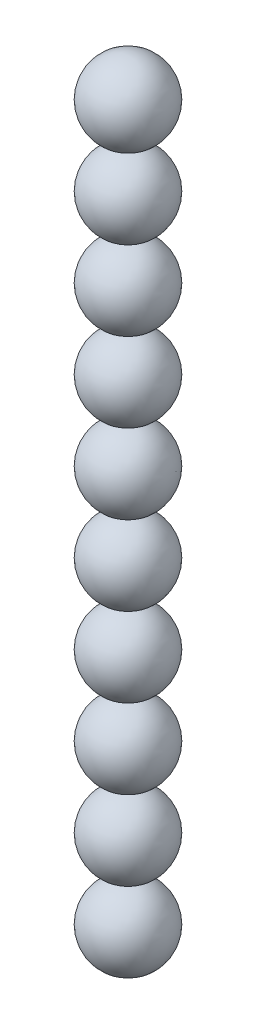
ISO-10303-21;
HEADER;
FILE_DESCRIPTION(('STEP AP214'),'2;1');
FILE_NAME('part.step','',(''),(''),'','','');
FILE_SCHEMA(('AUTOMOTIVE_DESIGN { 1 0 10303 214 1 1 1 1 }'));
ENDSEC;
DATA;
#1=APPLICATION_CONTEXT('core data for automotive mechanical design processes');
#2=APPLICATION_PROTOCOL_DEFINITION('international standard','automotive_design',2000,#1);
#3=PRODUCT_CONTEXT('',#1,'mechanical');
#4=PRODUCT('Part','Part','',(#3));
#5=PRODUCT_RELATED_PRODUCT_CATEGORY('part','',(#4));
#6=PRODUCT_DEFINITION_FORMATION('','',#4);
#7=PRODUCT_DEFINITION_CONTEXT('part definition',#1,'design');
#8=PRODUCT_DEFINITION('design','',#6,#7);
#9=PRODUCT_DEFINITION_SHAPE('','',#8);
#10=(LENGTH_UNIT() NAMED_UNIT(*) SI_UNIT(.MILLI.,.METRE.));
#11=(NAMED_UNIT(*) PLANE_ANGLE_UNIT() SI_UNIT($,.RADIAN.));
#12=(NAMED_UNIT(*) SI_UNIT($,.STERADIAN.) SOLID_ANGLE_UNIT());
#13=UNCERTAINTY_MEASURE_WITH_UNIT(LENGTH_MEASURE(1.E-05),#10,'distance_accuracy_value','');
#14=(GEOMETRIC_REPRESENTATION_CONTEXT(3) GLOBAL_UNCERTAINTY_ASSIGNED_CONTEXT((#13)) GLOBAL_UNIT_ASSIGNED_CONTEXT((#10,
#11,#12)) REPRESENTATION_CONTEXT('',''));
#15=CARTESIAN_POINT('',(0.,0.,0.));
#16=DIRECTION('',(0.,0.,1.));
#17=DIRECTION('',(1.,0.,0.));
#18=AXIS2_PLACEMENT_3D('',#15,#16,#17);
#19=CARTESIAN_POINT('',(-1.96521518638125E-13,56.286,0.));
#20=DIRECTION('',(0.,1.,0.));
#21=DIRECTION('',(1.,0.,0.));
#22=AXIS2_PLACEMENT_3D('',#19,#20,#21);
#23=SPHERICAL_SURFACE('',#22,3.);
#24=CARTESIAN_POINT('',(-1.96521518638125E-13,59.286,0.));
#25=VERTEX_POINT('',#24);
#26=VERTEX_LOOP('',#25);
#27=FACE_BOUND('',#26,.T.);
#28=ADVANCED_FACE('F39',(#27),#23,.T.);
#29=CLOSED_SHELL('',(#28));
#30=MANIFOLD_SOLID_BREP('B2',#29);
#31=CARTESIAN_POINT('',(-1.74685794345E-13,50.032,0.));
#32=DIRECTION('',(0.,1.,0.));
#33=DIRECTION('',(1.,0.,0.));
#34=AXIS2_PLACEMENT_3D('',#31,#32,#33);
#35=SPHERICAL_SURFACE('',#34,3.);
#36=CARTESIAN_POINT('',(-1.74685794345E-13,53.032,0.));
#37=VERTEX_POINT('',#36);
#38=VERTEX_LOOP('',#37);
#39=FACE_BOUND('',#38,.T.);
#40=ADVANCED_FACE('F57',(#39),#35,.T.);
#41=CLOSED_SHELL('',(#40));
#42=MANIFOLD_SOLID_BREP('B6',#41);
#43=CARTESIAN_POINT('',(-1.52850070051875E-13,43.778,0.));
#44=DIRECTION('',(0.,1.,0.));
#45=DIRECTION('',(1.,0.,0.));
#46=AXIS2_PLACEMENT_3D('',#43,#44,#45);
#47=SPHERICAL_SURFACE('',#46,3.);
#48=CARTESIAN_POINT('',(-1.52850070051875E-13,46.778,0.));
#49=VERTEX_POINT('',#48);
#50=VERTEX_LOOP('',#49);
#51=FACE_BOUND('',#50,.T.);
#52=ADVANCED_FACE('F75',(#51),#47,.T.);
#53=CLOSED_SHELL('',(#52));
#54=MANIFOLD_SOLID_BREP('B35',#53);
#55=CARTESIAN_POINT('',(-1.3101434575875E-13,37.524,0.));
#56=DIRECTION('',(0.,1.,0.));
#57=DIRECTION('',(1.,0.,0.));
#58=AXIS2_PLACEMENT_3D('',#55,#56,#57);
#59=SPHERICAL_SURFACE('',#58,3.);
#60=CARTESIAN_POINT('',(-1.3101434575875E-13,40.524,0.));
#61=VERTEX_POINT('',#60);
#62=VERTEX_LOOP('',#61);
#63=FACE_BOUND('',#62,.T.);
#64=ADVANCED_FACE('F93',(#63),#59,.T.);
#65=CLOSED_SHELL('',(#64));
#66=MANIFOLD_SOLID_BREP('B53',#65);
#67=CARTESIAN_POINT('',(-1.09178621465625E-13,31.27,0.));
#68=DIRECTION('',(0.,1.,0.));
#69=DIRECTION('',(1.,0.,0.));
#70=AXIS2_PLACEMENT_3D('',#67,#68,#69);
#71=SPHERICAL_SURFACE('',#70,3.);
#72=CARTESIAN_POINT('',(-1.09178621465625E-13,34.27,0.));
#73=VERTEX_POINT('',#72);
#74=VERTEX_LOOP('',#73);
#75=FACE_BOUND('',#74,.T.);
#76=ADVANCED_FACE('F111',(#75),#71,.T.);
#77=CLOSED_SHELL('',(#76));
#78=MANIFOLD_SOLID_BREP('B71',#77);
#79=CARTESIAN_POINT('',(0.,25.016,0.));
#80=DIRECTION('',(0.,1.,0.));
#81=DIRECTION('',(1.,0.,0.));
#82=AXIS2_PLACEMENT_3D('',#79,#80,#81);
#83=SPHERICAL_SURFACE('',#82,3.);
#84=CARTESIAN_POINT('',(0.,28.016,0.));
#85=VERTEX_POINT('',#84);
#86=VERTEX_LOOP('',#85);
#87=FACE_BOUND('',#86,.T.);
#88=ADVANCED_FACE('F129',(#87),#83,.T.);
#89=CLOSED_SHELL('',(#88));
#90=MANIFOLD_SOLID_BREP('B89',#89);
#91=CARTESIAN_POINT('',(0.,18.762,0.));
#92=DIRECTION('',(0.,1.,0.));
#93=DIRECTION('',(1.,0.,0.));
#94=AXIS2_PLACEMENT_3D('',#91,#92,#93);
#95=SPHERICAL_SURFACE('',#94,3.);
#96=CARTESIAN_POINT('',(0.,21.762,0.));
#97=VERTEX_POINT('',#96);
#98=VERTEX_LOOP('',#97);
#99=FACE_BOUND('',#98,.T.);
#100=ADVANCED_FACE('F147',(#99),#95,.T.);
#101=CLOSED_SHELL('',(#100));
#102=MANIFOLD_SOLID_BREP('B107',#101);
#103=CARTESIAN_POINT('',(0.,12.508,0.));
#104=DIRECTION('',(0.,1.,0.));
#105=DIRECTION('',(1.,0.,0.));
#106=AXIS2_PLACEMENT_3D('',#103,#104,#105);
#107=SPHERICAL_SURFACE('',#106,3.);
#108=CARTESIAN_POINT('',(0.,15.508,0.));
#109=VERTEX_POINT('',#108);
#110=VERTEX_LOOP('',#109);
#111=FACE_BOUND('',#110,.T.);
#112=ADVANCED_FACE('F165',(#111),#107,.T.);
#113=CLOSED_SHELL('',(#112));
#114=MANIFOLD_SOLID_BREP('B125',#113);
#115=CARTESIAN_POINT('',(0.,6.254,0.));
#116=DIRECTION('',(0.,1.,0.));
#117=DIRECTION('',(1.,0.,0.));
#118=AXIS2_PLACEMENT_3D('',#115,#116,#117);
#119=SPHERICAL_SURFACE('',#118,3.);
#120=CARTESIAN_POINT('',(0.,9.254,0.));
#121=VERTEX_POINT('',#120);
#122=VERTEX_LOOP('',#121);
#123=FACE_BOUND('',#122,.T.);
#124=ADVANCED_FACE('F182',(#123),#119,.T.);
#125=CLOSED_SHELL('',(#124));
#126=MANIFOLD_SOLID_BREP('B143',#125);
#127=CARTESIAN_POINT('',(0.,0.,0.));
#128=DIRECTION('',(0.,1.,0.));
#129=DIRECTION('',(1.,0.,0.));
#130=AXIS2_PLACEMENT_3D('',#127,#128,#129);
#131=SPHERICAL_SURFACE('',#130,3.);
#132=CARTESIAN_POINT('',(0.,3.,0.));
#133=VERTEX_POINT('',#132);
#134=VERTEX_LOOP('',#133);
#135=FACE_BOUND('',#134,.T.);
#136=ADVANCED_FACE('F194',(#135),#131,.T.);
#137=CLOSED_SHELL('',(#136));
#138=MANIFOLD_SOLID_BREP('B161',#137);
#139=ADVANCED_BREP_SHAPE_REPRESENTATION('',(#18,#30,#42,#54,#66,#78,#90,#102,#114,#126,#138),#14);
#140=SHAPE_DEFINITION_REPRESENTATION(#9,#139);
ENDSEC;
END-ISO-10303-21;
